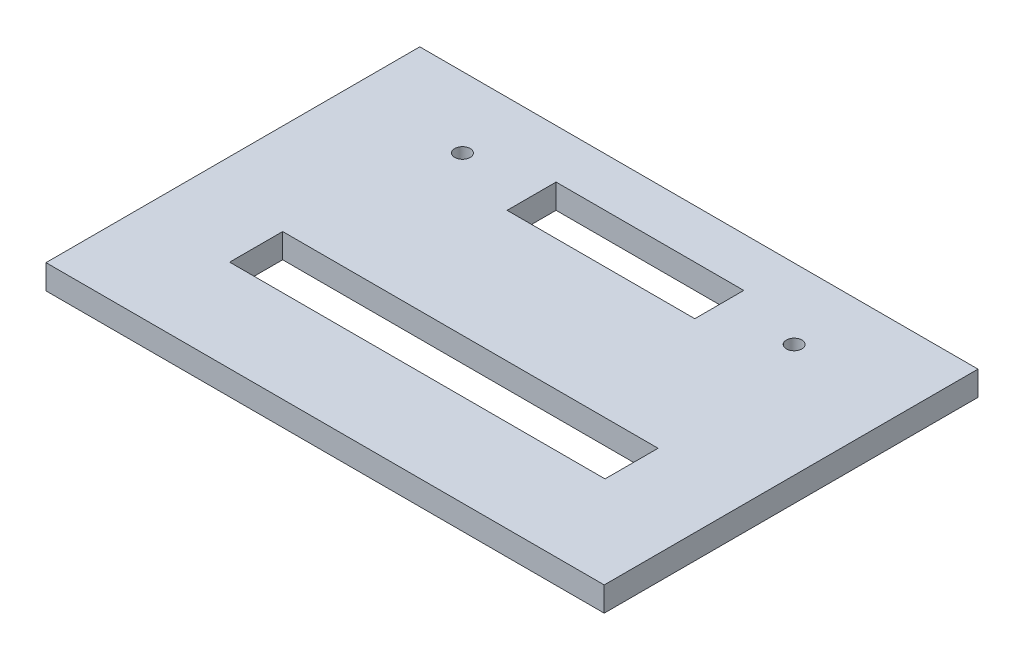
ISO-10303-21;
HEADER;
FILE_DESCRIPTION(('STEP AP214'),'2;1');
FILE_NAME('part.step','',(''),(''),'','','');
FILE_SCHEMA(('AUTOMOTIVE_DESIGN { 1 0 10303 214 1 1 1 1 }'));
ENDSEC;
DATA;
#1=APPLICATION_CONTEXT('core data for automotive mechanical design processes');
#2=APPLICATION_PROTOCOL_DEFINITION('international standard','automotive_design',2000,#1);
#3=PRODUCT_CONTEXT('',#1,'mechanical');
#4=PRODUCT('Part','Part','',(#3));
#5=PRODUCT_RELATED_PRODUCT_CATEGORY('part','',(#4));
#6=PRODUCT_DEFINITION_FORMATION('','',#4);
#7=PRODUCT_DEFINITION_CONTEXT('part definition',#1,'design');
#8=PRODUCT_DEFINITION('design','',#6,#7);
#9=PRODUCT_DEFINITION_SHAPE('','',#8);
#10=(LENGTH_UNIT() NAMED_UNIT(*) SI_UNIT(.MILLI.,.METRE.));
#11=(NAMED_UNIT(*) PLANE_ANGLE_UNIT() SI_UNIT($,.RADIAN.));
#12=(NAMED_UNIT(*) SI_UNIT($,.STERADIAN.) SOLID_ANGLE_UNIT());
#13=UNCERTAINTY_MEASURE_WITH_UNIT(LENGTH_MEASURE(1.E-05),#10,'distance_accuracy_value','');
#14=(GEOMETRIC_REPRESENTATION_CONTEXT(3) GLOBAL_UNCERTAINTY_ASSIGNED_CONTEXT((#13)) GLOBAL_UNIT_ASSIGNED_CONTEXT((#10,
#11,#12)) REPRESENTATION_CONTEXT('',''));
#15=CARTESIAN_POINT('',(0.,0.,0.));
#16=DIRECTION('',(0.,0.,1.));
#17=DIRECTION('',(1.,0.,0.));
#18=AXIS2_PLACEMENT_3D('',#15,#16,#17);
#19=CARTESIAN_POINT('',(34.2,3.,22.9));
#20=DIRECTION('',(-1.,0.,0.));
#21=DIRECTION('',(0.,0.,1.));
#22=AXIS2_PLACEMENT_3D('',#19,#20,#21);
#23=PLANE('',#22);
#24=DIRECTION('',(0.,0.,-1.));
#25=VECTOR('',#24,1.);
#26=CARTESIAN_POINT('',(34.2,0.,22.9));
#27=LINE('',#26,#25);
#28=CARTESIAN_POINT('',(34.2,0.,22.9));
#29=VERTEX_POINT('',#28);
#30=CARTESIAN_POINT('',(34.2,0.,-22.9));
#31=VERTEX_POINT('',#30);
#32=EDGE_CURVE('E198',#29,#31,#27,.T.);
#33=ORIENTED_EDGE('',*,*,#32,.T.);
#34=DIRECTION('',(0.,-1.,0.));
#35=VECTOR('',#34,1.);
#36=CARTESIAN_POINT('',(34.2,3.,-22.9));
#37=LINE('',#36,#35);
#38=CARTESIAN_POINT('',(34.2,3.,-22.9));
#39=VERTEX_POINT('',#38);
#40=EDGE_CURVE('E11',#39,#31,#37,.T.);
#41=ORIENTED_EDGE('',*,*,#40,.F.);
#42=DIRECTION('',(0.,0.,-1.));
#43=VECTOR('',#42,1.);
#44=CARTESIAN_POINT('',(34.2,3.,22.9));
#45=LINE('',#44,#43);
#46=CARTESIAN_POINT('',(34.2,3.,22.9));
#47=VERTEX_POINT('',#46);
#48=EDGE_CURVE('E201',#47,#39,#45,.T.);
#49=ORIENTED_EDGE('',*,*,#48,.F.);
#50=DIRECTION('',(0.,-1.,0.));
#51=VECTOR('',#50,1.);
#52=CARTESIAN_POINT('',(34.2,3.,22.9));
#53=LINE('',#52,#51);
#54=EDGE_CURVE('E211',#47,#29,#53,.T.);
#55=ORIENTED_EDGE('',*,*,#54,.T.);
#56=EDGE_LOOP('',(#33,#41,#49,#55));
#57=FACE_BOUND('',#56,.T.);
#58=ADVANCED_FACE('F32',(#57),#23,.F.);
#59=CARTESIAN_POINT('',(-34.2,3.,-22.9));
#60=DIRECTION('',(0.,0.,1.));
#61=DIRECTION('',(1.,0.,0.));
#62=AXIS2_PLACEMENT_3D('',#59,#60,#61);
#63=PLANE('',#62);
#64=DIRECTION('',(-1.,0.,0.));
#65=VECTOR('',#64,1.);
#66=CARTESIAN_POINT('',(-34.2,0.,-22.9));
#67=LINE('',#66,#65);
#68=CARTESIAN_POINT('',(-34.2,0.,-22.9));
#69=VERTEX_POINT('',#68);
#70=EDGE_CURVE('E214',#31,#69,#67,.T.);
#71=ORIENTED_EDGE('',*,*,#70,.T.);
#72=DIRECTION('',(0.,-1.,0.));
#73=VECTOR('',#72,1.);
#74=CARTESIAN_POINT('',(-34.2,3.,-22.9));
#75=LINE('',#74,#73);
#76=CARTESIAN_POINT('',(-34.2,3.,-22.9));
#77=VERTEX_POINT('',#76);
#78=EDGE_CURVE('E39',#77,#69,#75,.T.);
#79=ORIENTED_EDGE('',*,*,#78,.F.);
#80=DIRECTION('',(-1.,0.,0.));
#81=VECTOR('',#80,1.);
#82=CARTESIAN_POINT('',(-34.2,3.,-22.9));
#83=LINE('',#82,#81);
#84=EDGE_CURVE('E204',#39,#77,#83,.T.);
#85=ORIENTED_EDGE('',*,*,#84,.F.);
#86=ORIENTED_EDGE('',*,*,#40,.T.);
#87=EDGE_LOOP('',(#71,#79,#85,#86));
#88=FACE_BOUND('',#87,.T.);
#89=ADVANCED_FACE('F243',(#88),#63,.F.);
#90=CARTESIAN_POINT('',(-34.2,3.,22.9));
#91=DIRECTION('',(1.,0.,0.));
#92=DIRECTION('',(0.,0.,-1.));
#93=AXIS2_PLACEMENT_3D('',#90,#91,#92);
#94=PLANE('',#93);
#95=DIRECTION('',(0.,0.,1.));
#96=VECTOR('',#95,1.);
#97=CARTESIAN_POINT('',(-34.2,0.,22.9));
#98=LINE('',#97,#96);
#99=CARTESIAN_POINT('',(-34.2,0.,22.9));
#100=VERTEX_POINT('',#99);
#101=EDGE_CURVE('E216',#69,#100,#98,.T.);
#102=ORIENTED_EDGE('',*,*,#101,.T.);
#103=DIRECTION('',(0.,-1.,0.));
#104=VECTOR('',#103,1.);
#105=CARTESIAN_POINT('',(-34.2,3.,22.9));
#106=LINE('',#105,#104);
#107=CARTESIAN_POINT('',(-34.2,3.,22.9));
#108=VERTEX_POINT('',#107);
#109=EDGE_CURVE('E221',#108,#100,#106,.T.);
#110=ORIENTED_EDGE('',*,*,#109,.F.);
#111=DIRECTION('',(0.,0.,1.));
#112=VECTOR('',#111,1.);
#113=CARTESIAN_POINT('',(-34.2,3.,22.9));
#114=LINE('',#113,#112);
#115=EDGE_CURVE('E207',#77,#108,#114,.T.);
#116=ORIENTED_EDGE('',*,*,#115,.F.);
#117=ORIENTED_EDGE('',*,*,#78,.T.);
#118=EDGE_LOOP('',(#102,#110,#116,#117));
#119=FACE_BOUND('',#118,.T.);
#120=ADVANCED_FACE('F228',(#119),#94,.F.);
#121=CARTESIAN_POINT('',(-34.2,3.,22.9));
#122=DIRECTION('',(0.,0.,-1.));
#123=DIRECTION('',(-1.,0.,0.));
#124=AXIS2_PLACEMENT_3D('',#121,#122,#123);
#125=PLANE('',#124);
#126=DIRECTION('',(1.,0.,0.));
#127=VECTOR('',#126,1.);
#128=CARTESIAN_POINT('',(-34.2,0.,22.9));
#129=LINE('',#128,#127);
#130=EDGE_CURVE('E205',#100,#29,#129,.T.);
#131=ORIENTED_EDGE('',*,*,#130,.T.);
#132=ORIENTED_EDGE('',*,*,#54,.F.);
#133=DIRECTION('',(1.,0.,0.));
#134=VECTOR('',#133,1.);
#135=CARTESIAN_POINT('',(-34.2,3.,22.9));
#136=LINE('',#135,#134);
#137=EDGE_CURVE('E209',#108,#47,#136,.T.);
#138=ORIENTED_EDGE('',*,*,#137,.F.);
#139=ORIENTED_EDGE('',*,*,#109,.T.);
#140=EDGE_LOOP('',(#131,#132,#138,#139));
#141=FACE_BOUND('',#140,.T.);
#142=ADVANCED_FACE('F236',(#141),#125,.F.);
#143=CARTESIAN_POINT('',(0.,3.,0.));
#144=DIRECTION('',(0.,-1.,0.));
#145=DIRECTION('',(0.,0.,-1.));
#146=AXIS2_PLACEMENT_3D('',#143,#144,#145);
#147=PLANE('',#146);
#148=DIRECTION('',(-1.,0.,0.));
#149=VECTOR('',#148,1.);
#150=CARTESIAN_POINT('',(23.,3.,5.1));
#151=LINE('',#150,#149);
#152=CARTESIAN_POINT('',(23.,3.,5.1));
#153=VERTEX_POINT('',#152);
#154=CARTESIAN_POINT('',(-23.,3.,5.1));
#155=VERTEX_POINT('',#154);
#156=EDGE_CURVE('E147',#153,#155,#151,.T.);
#157=ORIENTED_EDGE('',*,*,#156,.F.);
#158=DIRECTION('',(0.,0.,-1.));
#159=VECTOR('',#158,1.);
#160=CARTESIAN_POINT('',(23.,3.,5.1));
#161=LINE('',#160,#159);
#162=CARTESIAN_POINT('',(23.,3.,11.6));
#163=VERTEX_POINT('',#162);
#164=EDGE_CURVE('E46',#163,#153,#161,.T.);
#165=ORIENTED_EDGE('',*,*,#164,.F.);
#166=DIRECTION('',(1.,0.,0.));
#167=VECTOR('',#166,1.);
#168=CARTESIAN_POINT('',(23.,3.,11.6));
#169=LINE('',#168,#167);
#170=CARTESIAN_POINT('',(-23.,3.,11.6));
#171=VERTEX_POINT('',#170);
#172=EDGE_CURVE('E138',#171,#163,#169,.T.);
#173=ORIENTED_EDGE('',*,*,#172,.F.);
#174=DIRECTION('',(0.,0.,1.));
#175=VECTOR('',#174,1.);
#176=CARTESIAN_POINT('',(-23.,3.,5.1));
#177=LINE('',#176,#175);
#178=EDGE_CURVE('E141',#155,#171,#177,.T.);
#179=ORIENTED_EDGE('',*,*,#178,.F.);
#180=EDGE_LOOP('',(#157,#165,#173,#179));
#181=FACE_BOUND('',#180,.T.);
#182=DIRECTION('',(-1.,0.,0.));
#183=VECTOR('',#182,1.);
#184=CARTESIAN_POINT('',(11.5,3.,-16.9));
#185=LINE('',#184,#183);
#186=CARTESIAN_POINT('',(11.5,3.,-16.9));
#187=VERTEX_POINT('',#186);
#188=CARTESIAN_POINT('',(-11.5,3.,-16.9));
#189=VERTEX_POINT('',#188);
#190=EDGE_CURVE('E172',#187,#189,#185,.T.);
#191=ORIENTED_EDGE('',*,*,#190,.F.);
#192=DIRECTION('',(0.,0.,-1.));
#193=VECTOR('',#192,1.);
#194=CARTESIAN_POINT('',(11.5,3.,-16.9));
#195=LINE('',#194,#193);
#196=CARTESIAN_POINT('',(11.5,3.,-10.9));
#197=VERTEX_POINT('',#196);
#198=EDGE_CURVE('E153',#197,#187,#195,.T.);
#199=ORIENTED_EDGE('',*,*,#198,.F.);
#200=DIRECTION('',(1.,0.,0.));
#201=VECTOR('',#200,1.);
#202=CARTESIAN_POINT('',(11.5,3.,-10.9));
#203=LINE('',#202,#201);
#204=CARTESIAN_POINT('',(-11.5,3.,-10.9));
#205=VERTEX_POINT('',#204);
#206=EDGE_CURVE('E161',#205,#197,#203,.T.);
#207=ORIENTED_EDGE('',*,*,#206,.F.);
#208=DIRECTION('',(0.,0.,1.));
#209=VECTOR('',#208,1.);
#210=CARTESIAN_POINT('',(-11.5,3.,-16.9));
#211=LINE('',#210,#209);
#212=EDGE_CURVE('E175',#189,#205,#211,.T.);
#213=ORIENTED_EDGE('',*,*,#212,.F.);
#214=EDGE_LOOP('',(#191,#199,#207,#213));
#215=FACE_BOUND('',#214,.T.);
#216=CARTESIAN_POINT('',(20.32,3.,-14.25));
#217=DIRECTION('',(0.,1.,0.));
#218=DIRECTION('',(0.,0.,-1.));
#219=AXIS2_PLACEMENT_3D('',#216,#217,#218);
#220=CIRCLE('',#219,0.950000000000002);
#221=CARTESIAN_POINT('',(20.32,3.,-15.2));
#222=VERTEX_POINT('',#221);
#223=EDGE_CURVE('E182',#222,#222,#220,.T.);
#224=ORIENTED_EDGE('',*,*,#223,.F.);
#225=EDGE_LOOP('',(#224));
#226=FACE_BOUND('',#225,.T.);
#227=CARTESIAN_POINT('',(-20.32,3.,-14.25));
#228=DIRECTION('',(0.,1.,0.));
#229=DIRECTION('',(0.,0.,1.));
#230=AXIS2_PLACEMENT_3D('',#227,#228,#229);
#231=CIRCLE('',#230,0.950000000000001);
#232=CARTESIAN_POINT('',(-20.32,3.,-13.3));
#233=VERTEX_POINT('',#232);
#234=EDGE_CURVE('E192',#233,#233,#231,.T.);
#235=ORIENTED_EDGE('',*,*,#234,.F.);
#236=EDGE_LOOP('',(#235));
#237=FACE_BOUND('',#236,.T.);
#238=ORIENTED_EDGE('',*,*,#48,.T.);
#239=ORIENTED_EDGE('',*,*,#84,.T.);
#240=ORIENTED_EDGE('',*,*,#115,.T.);
#241=ORIENTED_EDGE('',*,*,#137,.T.);
#242=EDGE_LOOP('',(#238,#239,#240,#241));
#243=FACE_BOUND('',#242,.T.);
#244=ADVANCED_FACE('F242',(#181,#215,#226,#237,#243),#147,.F.);
#245=CARTESIAN_POINT('',(0.,0.,0.));
#246=DIRECTION('',(0.,-1.,0.));
#247=DIRECTION('',(0.,0.,-1.));
#248=AXIS2_PLACEMENT_3D('',#245,#246,#247);
#249=PLANE('',#248);
#250=DIRECTION('',(0.,0.,-1.));
#251=VECTOR('',#250,1.);
#252=CARTESIAN_POINT('',(23.,0.,5.1));
#253=LINE('',#252,#251);
#254=CARTESIAN_POINT('',(23.,0.,11.6));
#255=VERTEX_POINT('',#254);
#256=CARTESIAN_POINT('',(23.,0.,5.1));
#257=VERTEX_POINT('',#256);
#258=EDGE_CURVE('E122',#255,#257,#253,.T.);
#259=ORIENTED_EDGE('',*,*,#258,.T.);
#260=DIRECTION('',(-1.,0.,0.));
#261=VECTOR('',#260,1.);
#262=CARTESIAN_POINT('',(23.,0.,5.1));
#263=LINE('',#262,#261);
#264=CARTESIAN_POINT('',(-23.,0.,5.1));
#265=VERTEX_POINT('',#264);
#266=EDGE_CURVE('E131',#257,#265,#263,.T.);
#267=ORIENTED_EDGE('',*,*,#266,.T.);
#268=DIRECTION('',(0.,0.,1.));
#269=VECTOR('',#268,1.);
#270=CARTESIAN_POINT('',(-23.,0.,5.1));
#271=LINE('',#270,#269);
#272=CARTESIAN_POINT('',(-23.,0.,11.6));
#273=VERTEX_POINT('',#272);
#274=EDGE_CURVE('E54',#265,#273,#271,.T.);
#275=ORIENTED_EDGE('',*,*,#274,.T.);
#276=DIRECTION('',(1.,0.,0.));
#277=VECTOR('',#276,1.);
#278=CARTESIAN_POINT('',(23.,0.,11.6));
#279=LINE('',#278,#277);
#280=EDGE_CURVE('E128',#273,#255,#279,.T.);
#281=ORIENTED_EDGE('',*,*,#280,.T.);
#282=EDGE_LOOP('',(#259,#267,#275,#281));
#283=FACE_BOUND('',#282,.T.);
#284=DIRECTION('',(0.,0.,-1.));
#285=VECTOR('',#284,1.);
#286=CARTESIAN_POINT('',(11.5,0.,-16.9));
#287=LINE('',#286,#285);
#288=CARTESIAN_POINT('',(11.5,0.,-10.9));
#289=VERTEX_POINT('',#288);
#290=CARTESIAN_POINT('',(11.5,0.,-16.9));
#291=VERTEX_POINT('',#290);
#292=EDGE_CURVE('E157',#289,#291,#287,.T.);
#293=ORIENTED_EDGE('',*,*,#292,.T.);
#294=DIRECTION('',(-1.,0.,0.));
#295=VECTOR('',#294,1.);
#296=CARTESIAN_POINT('',(11.5,0.,-16.9));
#297=LINE('',#296,#295);
#298=CARTESIAN_POINT('',(-11.5,0.,-16.9));
#299=VERTEX_POINT('',#298);
#300=EDGE_CURVE('E160',#291,#299,#297,.T.);
#301=ORIENTED_EDGE('',*,*,#300,.T.);
#302=DIRECTION('',(0.,0.,1.));
#303=VECTOR('',#302,1.);
#304=CARTESIAN_POINT('',(-11.5,0.,-16.9));
#305=LINE('',#304,#303);
#306=CARTESIAN_POINT('',(-11.5,0.,-10.9));
#307=VERTEX_POINT('',#306);
#308=EDGE_CURVE('E164',#299,#307,#305,.T.);
#309=ORIENTED_EDGE('',*,*,#308,.T.);
#310=DIRECTION('',(1.,0.,0.));
#311=VECTOR('',#310,1.);
#312=CARTESIAN_POINT('',(11.5,0.,-10.9));
#313=LINE('',#312,#311);
#314=EDGE_CURVE('E167',#307,#289,#313,.T.);
#315=ORIENTED_EDGE('',*,*,#314,.T.);
#316=EDGE_LOOP('',(#293,#301,#309,#315));
#317=FACE_BOUND('',#316,.T.);
#318=CARTESIAN_POINT('',(20.32,0.,-14.25));
#319=DIRECTION('',(0.,1.,0.));
#320=DIRECTION('',(0.,0.,-1.));
#321=AXIS2_PLACEMENT_3D('',#318,#319,#320);
#322=CIRCLE('',#321,0.950000000000002);
#323=CARTESIAN_POINT('',(20.32,0.,-15.2));
#324=VERTEX_POINT('',#323);
#325=EDGE_CURVE('E189',#324,#324,#322,.T.);
#326=ORIENTED_EDGE('',*,*,#325,.T.);
#327=EDGE_LOOP('',(#326));
#328=FACE_BOUND('',#327,.T.);
#329=CARTESIAN_POINT('',(-20.32,0.,-14.25));
#330=DIRECTION('',(0.,1.,0.));
#331=DIRECTION('',(0.,0.,1.));
#332=AXIS2_PLACEMENT_3D('',#329,#330,#331);
#333=CIRCLE('',#332,0.950000000000001);
#334=CARTESIAN_POINT('',(-20.32,0.,-13.3));
#335=VERTEX_POINT('',#334);
#336=EDGE_CURVE('E195',#335,#335,#333,.T.);
#337=ORIENTED_EDGE('',*,*,#336,.T.);
#338=EDGE_LOOP('',(#337));
#339=FACE_BOUND('',#338,.T.);
#340=ORIENTED_EDGE('',*,*,#32,.F.);
#341=ORIENTED_EDGE('',*,*,#130,.F.);
#342=ORIENTED_EDGE('',*,*,#101,.F.);
#343=ORIENTED_EDGE('',*,*,#70,.F.);
#344=EDGE_LOOP('',(#340,#341,#342,#343));
#345=FACE_BOUND('',#344,.T.);
#346=ADVANCED_FACE('F135',(#283,#317,#328,#339,#345),#249,.T.);
#347=CARTESIAN_POINT('',(-20.32,0.,-14.25));
#348=DIRECTION('',(0.,1.,0.));
#349=DIRECTION('',(0.,0.,1.));
#350=AXIS2_PLACEMENT_3D('',#347,#348,#349);
#351=CYLINDRICAL_SURFACE('',#350,0.950000000000001);
#352=ORIENTED_EDGE('',*,*,#336,.F.);
#353=EDGE_LOOP('',(#352));
#354=FACE_BOUND('',#353,.T.);
#355=ORIENTED_EDGE('',*,*,#234,.T.);
#356=EDGE_LOOP('',(#355));
#357=FACE_BOUND('',#356,.T.);
#358=ADVANCED_FACE('F255',(#354,#357),#351,.F.);
#359=CARTESIAN_POINT('',(20.32,0.,-14.25));
#360=DIRECTION('',(0.,1.,0.));
#361=DIRECTION('',(0.,0.,1.));
#362=AXIS2_PLACEMENT_3D('',#359,#360,#361);
#363=CYLINDRICAL_SURFACE('',#362,0.950000000000002);
#364=ORIENTED_EDGE('',*,*,#325,.F.);
#365=EDGE_LOOP('',(#364));
#366=FACE_BOUND('',#365,.T.);
#367=ORIENTED_EDGE('',*,*,#223,.T.);
#368=EDGE_LOOP('',(#367));
#369=FACE_BOUND('',#368,.T.);
#370=ADVANCED_FACE('F261',(#366,#369),#363,.F.);
#371=CARTESIAN_POINT('',(11.5,0.,-16.9));
#372=DIRECTION('',(1.,0.,0.));
#373=DIRECTION('',(0.,0.,-1.));
#374=AXIS2_PLACEMENT_3D('',#371,#372,#373);
#375=PLANE('',#374);
#376=ORIENTED_EDGE('',*,*,#198,.T.);
#377=DIRECTION('',(0.,1.,0.));
#378=VECTOR('',#377,1.);
#379=CARTESIAN_POINT('',(11.5,0.,-16.9));
#380=LINE('',#379,#378);
#381=EDGE_CURVE('E170',#291,#187,#380,.T.);
#382=ORIENTED_EDGE('',*,*,#381,.F.);
#383=ORIENTED_EDGE('',*,*,#292,.F.);
#384=DIRECTION('',(0.,1.,0.));
#385=VECTOR('',#384,1.);
#386=CARTESIAN_POINT('',(11.5,0.,-10.9));
#387=LINE('',#386,#385);
#388=EDGE_CURVE('E180',#289,#197,#387,.T.);
#389=ORIENTED_EDGE('',*,*,#388,.T.);
#390=EDGE_LOOP('',(#376,#382,#383,#389));
#391=FACE_BOUND('',#390,.T.);
#392=ADVANCED_FACE('F265',(#391),#375,.F.);
#393=CARTESIAN_POINT('',(11.5,0.,-10.9));
#394=DIRECTION('',(0.,0.,1.));
#395=DIRECTION('',(1.,0.,0.));
#396=AXIS2_PLACEMENT_3D('',#393,#394,#395);
#397=PLANE('',#396);
#398=ORIENTED_EDGE('',*,*,#206,.T.);
#399=ORIENTED_EDGE('',*,*,#388,.F.);
#400=ORIENTED_EDGE('',*,*,#314,.F.);
#401=DIRECTION('',(0.,1.,0.));
#402=VECTOR('',#401,1.);
#403=CARTESIAN_POINT('',(-11.5,0.,-10.9));
#404=LINE('',#403,#402);
#405=EDGE_CURVE('E183',#307,#205,#404,.T.);
#406=ORIENTED_EDGE('',*,*,#405,.T.);
#407=EDGE_LOOP('',(#398,#399,#400,#406));
#408=FACE_BOUND('',#407,.T.);
#409=ADVANCED_FACE('F269',(#408),#397,.F.);
#410=CARTESIAN_POINT('',(-11.5,0.,-16.9));
#411=DIRECTION('',(-1.,0.,0.));
#412=DIRECTION('',(0.,0.,1.));
#413=AXIS2_PLACEMENT_3D('',#410,#411,#412);
#414=PLANE('',#413);
#415=ORIENTED_EDGE('',*,*,#212,.T.);
#416=ORIENTED_EDGE('',*,*,#405,.F.);
#417=ORIENTED_EDGE('',*,*,#308,.F.);
#418=DIRECTION('',(0.,1.,0.));
#419=VECTOR('',#418,1.);
#420=CARTESIAN_POINT('',(-11.5,0.,-16.9));
#421=LINE('',#420,#419);
#422=EDGE_CURVE('E185',#299,#189,#421,.T.);
#423=ORIENTED_EDGE('',*,*,#422,.T.);
#424=EDGE_LOOP('',(#415,#416,#417,#423));
#425=FACE_BOUND('',#424,.T.);
#426=ADVANCED_FACE('F274',(#425),#414,.F.);
#427=CARTESIAN_POINT('',(11.5,0.,-16.9));
#428=DIRECTION('',(0.,0.,-1.));
#429=DIRECTION('',(-1.,0.,0.));
#430=AXIS2_PLACEMENT_3D('',#427,#428,#429);
#431=PLANE('',#430);
#432=ORIENTED_EDGE('',*,*,#190,.T.);
#433=ORIENTED_EDGE('',*,*,#422,.F.);
#434=ORIENTED_EDGE('',*,*,#300,.F.);
#435=ORIENTED_EDGE('',*,*,#381,.T.);
#436=EDGE_LOOP('',(#432,#433,#434,#435));
#437=FACE_BOUND('',#436,.T.);
#438=ADVANCED_FACE('F271',(#437),#431,.F.);
#439=CARTESIAN_POINT('',(23.,0.,5.1));
#440=DIRECTION('',(1.,0.,0.));
#441=DIRECTION('',(0.,0.,-1.));
#442=AXIS2_PLACEMENT_3D('',#439,#440,#441);
#443=PLANE('',#442);
#444=ORIENTED_EDGE('',*,*,#164,.T.);
#445=DIRECTION('',(0.,1.,0.));
#446=VECTOR('',#445,1.);
#447=CARTESIAN_POINT('',(23.,0.,5.1));
#448=LINE('',#447,#446);
#449=EDGE_CURVE('E118',#257,#153,#448,.T.);
#450=ORIENTED_EDGE('',*,*,#449,.F.);
#451=ORIENTED_EDGE('',*,*,#258,.F.);
#452=DIRECTION('',(0.,1.,0.));
#453=VECTOR('',#452,1.);
#454=CARTESIAN_POINT('',(23.,0.,11.6));
#455=LINE('',#454,#453);
#456=EDGE_CURVE('E151',#255,#163,#455,.T.);
#457=ORIENTED_EDGE('',*,*,#456,.T.);
#458=EDGE_LOOP('',(#444,#450,#451,#457));
#459=FACE_BOUND('',#458,.T.);
#460=ADVANCED_FACE('F120',(#459),#443,.F.);
#461=CARTESIAN_POINT('',(23.,0.,11.6));
#462=DIRECTION('',(0.,0.,1.));
#463=DIRECTION('',(1.,0.,0.));
#464=AXIS2_PLACEMENT_3D('',#461,#462,#463);
#465=PLANE('',#464);
#466=ORIENTED_EDGE('',*,*,#172,.T.);
#467=ORIENTED_EDGE('',*,*,#456,.F.);
#468=ORIENTED_EDGE('',*,*,#280,.F.);
#469=DIRECTION('',(0.,1.,0.));
#470=VECTOR('',#469,1.);
#471=CARTESIAN_POINT('',(-23.,0.,11.6));
#472=LINE('',#471,#470);
#473=EDGE_CURVE('E154',#273,#171,#472,.T.);
#474=ORIENTED_EDGE('',*,*,#473,.T.);
#475=EDGE_LOOP('',(#466,#467,#468,#474));
#476=FACE_BOUND('',#475,.T.);
#477=ADVANCED_FACE('F284',(#476),#465,.F.);
#478=CARTESIAN_POINT('',(-23.,0.,5.1));
#479=DIRECTION('',(-1.,0.,0.));
#480=DIRECTION('',(0.,0.,1.));
#481=AXIS2_PLACEMENT_3D('',#478,#479,#480);
#482=PLANE('',#481);
#483=ORIENTED_EDGE('',*,*,#178,.T.);
#484=ORIENTED_EDGE('',*,*,#473,.F.);
#485=ORIENTED_EDGE('',*,*,#274,.F.);
#486=DIRECTION('',(0.,1.,0.));
#487=VECTOR('',#486,1.);
#488=CARTESIAN_POINT('',(-23.,0.,5.1));
#489=LINE('',#488,#487);
#490=EDGE_CURVE('E127',#265,#155,#489,.T.);
#491=ORIENTED_EDGE('',*,*,#490,.T.);
#492=EDGE_LOOP('',(#483,#484,#485,#491));
#493=FACE_BOUND('',#492,.T.);
#494=ADVANCED_FACE('F287',(#493),#482,.F.);
#495=CARTESIAN_POINT('',(23.,0.,5.1));
#496=DIRECTION('',(0.,0.,-1.));
#497=DIRECTION('',(-1.,0.,0.));
#498=AXIS2_PLACEMENT_3D('',#495,#496,#497);
#499=PLANE('',#498);
#500=ORIENTED_EDGE('',*,*,#156,.T.);
#501=ORIENTED_EDGE('',*,*,#490,.F.);
#502=ORIENTED_EDGE('',*,*,#266,.F.);
#503=ORIENTED_EDGE('',*,*,#449,.T.);
#504=EDGE_LOOP('',(#500,#501,#502,#503));
#505=FACE_BOUND('',#504,.T.);
#506=ADVANCED_FACE('F132',(#505),#499,.F.);
#507=CLOSED_SHELL('',(#58,#89,#120,#142,#244,#346,#358,#370,#392,#409,#426,#438,#460,#477,#494,#506));
#508=MANIFOLD_SOLID_BREP('B2',#507);
#509=ADVANCED_BREP_SHAPE_REPRESENTATION('',(#18,#508),#14);
#510=SHAPE_DEFINITION_REPRESENTATION(#9,#509);
ENDSEC;
END-ISO-10303-21;
